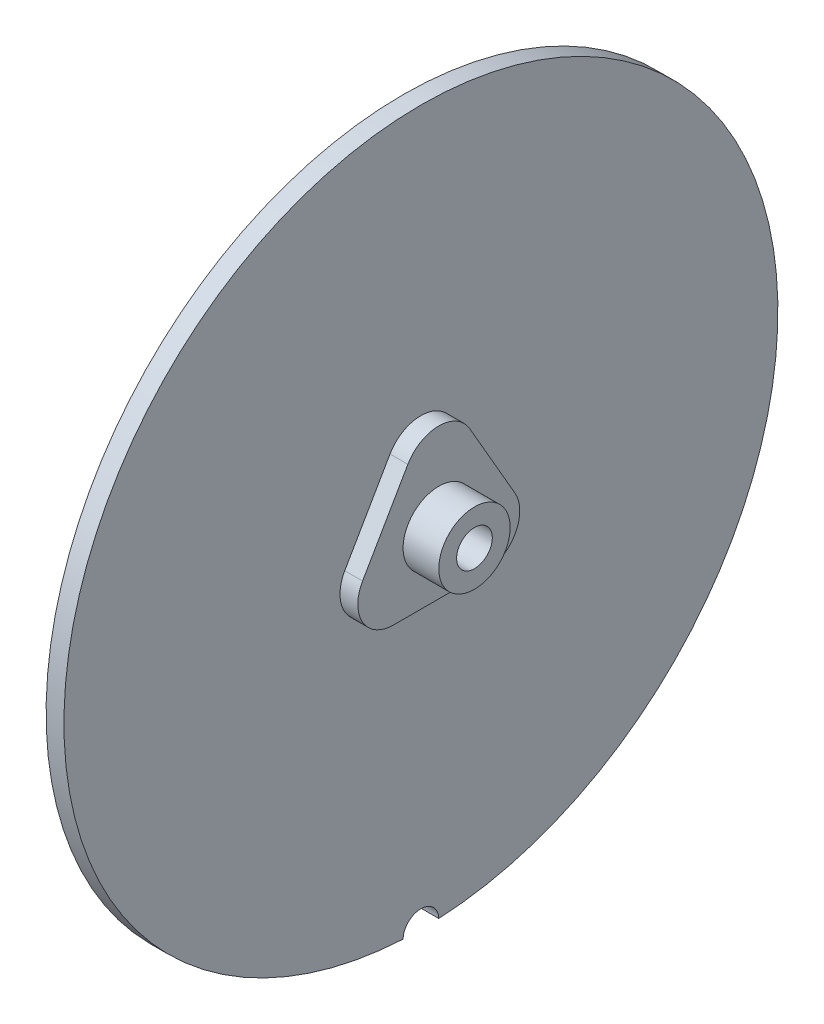
ISO-10303-21;
HEADER;
FILE_DESCRIPTION(('STEP AP214'),'2;1');
FILE_NAME('part.step','',(''),(''),'','','');
FILE_SCHEMA(('AUTOMOTIVE_DESIGN { 1 0 10303 214 1 1 1 1 }'));
ENDSEC;
DATA;
#1=APPLICATION_CONTEXT('core data for automotive mechanical design processes');
#2=APPLICATION_PROTOCOL_DEFINITION('international standard','automotive_design',2000,#1);
#3=PRODUCT_CONTEXT('',#1,'mechanical');
#4=PRODUCT('Part','Part','',(#3));
#5=PRODUCT_RELATED_PRODUCT_CATEGORY('part','',(#4));
#6=PRODUCT_DEFINITION_FORMATION('','',#4);
#7=PRODUCT_DEFINITION_CONTEXT('part definition',#1,'design');
#8=PRODUCT_DEFINITION('design','',#6,#7);
#9=PRODUCT_DEFINITION_SHAPE('','',#8);
#10=(LENGTH_UNIT() NAMED_UNIT(*) SI_UNIT(.MILLI.,.METRE.));
#11=(NAMED_UNIT(*) PLANE_ANGLE_UNIT() SI_UNIT($,.RADIAN.));
#12=(NAMED_UNIT(*) SI_UNIT($,.STERADIAN.) SOLID_ANGLE_UNIT());
#13=UNCERTAINTY_MEASURE_WITH_UNIT(LENGTH_MEASURE(1.E-05),#10,'distance_accuracy_value','');
#14=(GEOMETRIC_REPRESENTATION_CONTEXT(3) GLOBAL_UNCERTAINTY_ASSIGNED_CONTEXT((#13)) GLOBAL_UNIT_ASSIGNED_CONTEXT((#10,
#11,#12)) REPRESENTATION_CONTEXT('',''));
#15=CARTESIAN_POINT('',(0.,0.,0.));
#16=DIRECTION('',(0.,0.,1.));
#17=DIRECTION('',(1.,0.,0.));
#18=AXIS2_PLACEMENT_3D('',#15,#16,#17);
#19=CARTESIAN_POINT('',(3.175,-63.5,0.));
#20=DIRECTION('',(-1.,0.,0.));
#21=DIRECTION('',(0.,0.,1.));
#22=AXIS2_PLACEMENT_3D('',#19,#20,#21);
#23=CYLINDRICAL_SURFACE('',#22,3.17500000000022);
#24=CARTESIAN_POINT('',(0.,-63.5,0.));
#25=DIRECTION('',(1.,0.,0.));
#26=DIRECTION('',(0.,0.,-1.));
#27=AXIS2_PLACEMENT_3D('',#24,#25,#26);
#28=CIRCLE('',#27,3.17500000000022);
#29=CARTESIAN_POINT('',(0.,-63.420625,-3.17400765742244));
#30=VERTEX_POINT('',#29);
#31=CARTESIAN_POINT('',(0.,-63.420625,3.1740076574224));
#32=VERTEX_POINT('',#31);
#33=EDGE_CURVE('E113',#30,#32,#28,.T.);
#34=ORIENTED_EDGE('',*,*,#33,.F.);
#35=DIRECTION('',(-1.,0.,0.));
#36=VECTOR('',#35,1.);
#37=CARTESIAN_POINT('',(3.175,-63.420625,-3.17400765742244));
#38=LINE('',#37,#36);
#39=CARTESIAN_POINT('',(3.175,-63.420625,-3.17400765742244));
#40=VERTEX_POINT('',#39);
#41=EDGE_CURVE('E109',#40,#30,#38,.T.);
#42=ORIENTED_EDGE('',*,*,#41,.F.);
#43=CARTESIAN_POINT('',(3.175,-63.5,0.));
#44=DIRECTION('',(1.,0.,0.));
#45=DIRECTION('',(0.,0.,-1.));
#46=AXIS2_PLACEMENT_3D('',#43,#44,#45);
#47=CIRCLE('',#46,3.17500000000022);
#48=CARTESIAN_POINT('',(3.175,-63.420625,3.1740076574224));
#49=VERTEX_POINT('',#48);
#50=EDGE_CURVE('E114',#40,#49,#47,.T.);
#51=ORIENTED_EDGE('',*,*,#50,.T.);
#52=DIRECTION('',(-1.,0.,0.));
#53=VECTOR('',#52,1.);
#54=CARTESIAN_POINT('',(3.175,-63.420625,3.1740076574224));
#55=LINE('',#54,#53);
#56=EDGE_CURVE('E121',#49,#32,#55,.T.);
#57=ORIENTED_EDGE('',*,*,#56,.T.);
#58=EDGE_LOOP('',(#34,#42,#51,#57));
#59=FACE_BOUND('',#58,.T.);
#60=ADVANCED_FACE('F44',(#59),#23,.F.);
#61=CARTESIAN_POINT('',(3.175,0.,0.));
#62=DIRECTION('',(-1.,0.,0.));
#63=DIRECTION('',(0.,0.,1.));
#64=AXIS2_PLACEMENT_3D('',#61,#62,#63);
#65=CYLINDRICAL_SURFACE('',#64,3.175);
#66=CARTESIAN_POINT('',(0.,0.,0.));
#67=DIRECTION('',(1.,0.,0.));
#68=DIRECTION('',(0.,0.,-1.));
#69=AXIS2_PLACEMENT_3D('',#66,#67,#68);
#70=CIRCLE('',#69,3.175);
#71=CARTESIAN_POINT('',(0.,0.,-3.175));
#72=VERTEX_POINT('',#71);
#73=EDGE_CURVE('E138',#72,#72,#70,.T.);
#74=ORIENTED_EDGE('',*,*,#73,.F.);
#75=EDGE_LOOP('',(#74));
#76=FACE_BOUND('',#75,.T.);
#77=CARTESIAN_POINT('',(12.7,0.,0.));
#78=DIRECTION('',(1.,0.,0.));
#79=DIRECTION('',(0.,0.,-1.));
#80=AXIS2_PLACEMENT_3D('',#77,#78,#79);
#81=CIRCLE('',#80,3.175);
#82=CARTESIAN_POINT('',(12.7,0.,-3.175));
#83=VERTEX_POINT('',#82);
#84=EDGE_CURVE('E216',#83,#83,#81,.T.);
#85=ORIENTED_EDGE('',*,*,#84,.T.);
#86=EDGE_LOOP('',(#85));
#87=FACE_BOUND('',#86,.T.);
#88=ADVANCED_FACE('F249',(#76,#87),#65,.F.);
#89=CARTESIAN_POINT('',(3.175,0.,0.));
#90=DIRECTION('',(-1.,0.,0.));
#91=DIRECTION('',(0.,0.,1.));
#92=AXIS2_PLACEMENT_3D('',#89,#90,#91);
#93=CYLINDRICAL_SURFACE('',#92,63.5);
#94=CARTESIAN_POINT('',(0.,0.,0.));
#95=DIRECTION('',(1.,0.,0.));
#96=DIRECTION('',(0.,0.,-1.));
#97=AXIS2_PLACEMENT_3D('',#94,#95,#96);
#98=CIRCLE('',#97,63.5);
#99=EDGE_CURVE('E133',#30,#32,#98,.T.);
#100=ORIENTED_EDGE('',*,*,#99,.T.);
#101=ORIENTED_EDGE('',*,*,#56,.F.);
#102=CARTESIAN_POINT('',(3.175,0.,0.));
#103=DIRECTION('',(1.,0.,0.));
#104=DIRECTION('',(0.,0.,-1.));
#105=AXIS2_PLACEMENT_3D('',#102,#103,#104);
#106=CIRCLE('',#105,63.5);
#107=EDGE_CURVE('E123',#40,#49,#106,.T.);
#108=ORIENTED_EDGE('',*,*,#107,.F.);
#109=ORIENTED_EDGE('',*,*,#41,.T.);
#110=EDGE_LOOP('',(#100,#101,#108,#109));
#111=FACE_BOUND('',#110,.T.);
#112=ADVANCED_FACE('F125',(#111),#93,.T.);
#113=CARTESIAN_POINT('',(3.175,0.,0.));
#114=DIRECTION('',(1.,0.,0.));
#115=DIRECTION('',(0.,0.,-1.));
#116=AXIS2_PLACEMENT_3D('',#113,#114,#115);
#117=PLANE('',#116);
#118=DIRECTION('',(0.,0.866025403784439,0.5));
#119=VECTOR('',#118,1.);
#120=CARTESIAN_POINT('',(3.175,-10.9985226280624,-19.05));
#121=LINE('',#120,#119);
#122=CARTESIAN_POINT('',(3.175,-1.47352262806237,-13.5507386859688));
#123=VERTEX_POINT('',#122);
#124=CARTESIAN_POINT('',(3.175,12.4720452561247,-5.49926131403119));
#125=VERTEX_POINT('',#124);
#126=EDGE_CURVE('E187',#123,#125,#121,.T.);
#127=ORIENTED_EDGE('',*,*,#126,.F.);
#128=CARTESIAN_POINT('',(3.175,-4.64852262806237,-8.05147737193763));
#129=DIRECTION('',(1.,0.,0.));
#130=DIRECTION('',(0.,0.,-1.));
#131=AXIS2_PLACEMENT_3D('',#128,#129,#130);
#132=CIRCLE('',#131,6.35);
#133=CARTESIAN_POINT('',(3.175,-10.9985226280624,-8.05147737193762));
#134=VERTEX_POINT('',#133);
#135=EDGE_CURVE('E11',#123,#134,#132,.F.);
#136=ORIENTED_EDGE('',*,*,#135,.T.);
#137=DIRECTION('',(0.,0.,-1.));
#138=VECTOR('',#137,1.);
#139=CARTESIAN_POINT('',(3.175,-10.9985226280624,19.05));
#140=LINE('',#139,#138);
#141=CARTESIAN_POINT('',(3.175,-10.9985226280624,8.05147737193764));
#142=VERTEX_POINT('',#141);
#143=EDGE_CURVE('E136',#142,#134,#140,.T.);
#144=ORIENTED_EDGE('',*,*,#143,.F.);
#145=CARTESIAN_POINT('',(3.175,-4.64852262806237,8.05147737193763));
#146=DIRECTION('',(1.,0.,0.));
#147=DIRECTION('',(0.,0.,-1.));
#148=AXIS2_PLACEMENT_3D('',#145,#146,#147);
#149=CIRCLE('',#148,6.35);
#150=CARTESIAN_POINT('',(3.175,-1.47352262806237,13.5507386859688));
#151=VERTEX_POINT('',#150);
#152=EDGE_CURVE('E53',#142,#151,#149,.F.);
#153=ORIENTED_EDGE('',*,*,#152,.T.);
#154=DIRECTION('',(0.,-0.866025403784439,0.5));
#155=VECTOR('',#154,1.);
#156=CARTESIAN_POINT('',(3.175,21.9970452561247,0.));
#157=LINE('',#156,#155);
#158=CARTESIAN_POINT('',(3.175,12.4720452561247,5.49926131403118));
#159=VERTEX_POINT('',#158);
#160=EDGE_CURVE('E185',#159,#151,#157,.T.);
#161=ORIENTED_EDGE('',*,*,#160,.F.);
#162=CARTESIAN_POINT('',(3.175,9.29704525612475,0.));
#163=DIRECTION('',(1.,0.,0.));
#164=DIRECTION('',(0.,0.,-1.));
#165=AXIS2_PLACEMENT_3D('',#162,#163,#164);
#166=CIRCLE('',#165,6.35);
#167=EDGE_CURVE('E177',#159,#125,#166,.F.);
#168=ORIENTED_EDGE('',*,*,#167,.T.);
#169=EDGE_LOOP('',(#127,#136,#144,#153,#161,#168));
#170=FACE_BOUND('',#169,.T.);
#171=ORIENTED_EDGE('',*,*,#50,.F.);
#172=ORIENTED_EDGE('',*,*,#107,.T.);
#173=EDGE_LOOP('',(#171,#172));
#174=FACE_BOUND('',#173,.T.);
#175=ADVANCED_FACE('F129',(#170,#174),#117,.T.);
#176=CARTESIAN_POINT('',(0.,0.,0.));
#177=DIRECTION('',(1.,0.,0.));
#178=DIRECTION('',(0.,0.,-1.));
#179=AXIS2_PLACEMENT_3D('',#176,#177,#178);
#180=PLANE('',#179);
#181=ORIENTED_EDGE('',*,*,#73,.T.);
#182=EDGE_LOOP('',(#181));
#183=FACE_BOUND('',#182,.T.);
#184=ORIENTED_EDGE('',*,*,#33,.T.);
#185=ORIENTED_EDGE('',*,*,#99,.F.);
#186=EDGE_LOOP('',(#184,#185));
#187=FACE_BOUND('',#186,.T.);
#188=ADVANCED_FACE('F260',(#183,#187),#180,.F.);
#189=CARTESIAN_POINT('',(6.35,0.,0.));
#190=DIRECTION('',(1.,0.,0.));
#191=DIRECTION('',(0.,0.,-1.));
#192=AXIS2_PLACEMENT_3D('',#189,#190,#191);
#193=PLANE('',#192);
#194=CARTESIAN_POINT('',(6.35,0.,0.));
#195=DIRECTION('',(1.,0.,0.));
#196=DIRECTION('',(0.,0.,-1.));
#197=AXIS2_PLACEMENT_3D('',#194,#195,#196);
#198=CIRCLE('',#197,6.35);
#199=CARTESIAN_POINT('',(6.35,0.,-6.35));
#200=VERTEX_POINT('',#199);
#201=EDGE_CURVE('E119',#200,#200,#198,.T.);
#202=ORIENTED_EDGE('',*,*,#201,.F.);
#203=EDGE_LOOP('',(#202));
#204=FACE_BOUND('',#203,.T.);
#205=DIRECTION('',(0.,0.866025403784439,0.5));
#206=VECTOR('',#205,1.);
#207=CARTESIAN_POINT('',(6.35,-10.9985226280624,-19.05));
#208=LINE('',#207,#206);
#209=CARTESIAN_POINT('',(6.35,-1.47352262806237,-13.5507386859688));
#210=VERTEX_POINT('',#209);
#211=CARTESIAN_POINT('',(6.35,12.4720452561247,-5.49926131403119));
#212=VERTEX_POINT('',#211);
#213=EDGE_CURVE('E202',#210,#212,#208,.T.);
#214=ORIENTED_EDGE('',*,*,#213,.T.);
#215=CARTESIAN_POINT('',(6.35,9.29704525612475,0.));
#216=DIRECTION('',(1.,0.,0.));
#217=DIRECTION('',(0.,0.,-1.));
#218=AXIS2_PLACEMENT_3D('',#215,#216,#217);
#219=CIRCLE('',#218,6.35);
#220=CARTESIAN_POINT('',(6.35,12.4720452561247,5.49926131403118));
#221=VERTEX_POINT('',#220);
#222=EDGE_CURVE('E169',#212,#221,#219,.T.);
#223=ORIENTED_EDGE('',*,*,#222,.T.);
#224=DIRECTION('',(0.,-0.866025403784439,0.5));
#225=VECTOR('',#224,1.);
#226=CARTESIAN_POINT('',(6.35,21.9970452561247,0.));
#227=LINE('',#226,#225);
#228=CARTESIAN_POINT('',(6.35,-1.47352262806237,13.5507386859688));
#229=VERTEX_POINT('',#228);
#230=EDGE_CURVE('E196',#221,#229,#227,.T.);
#231=ORIENTED_EDGE('',*,*,#230,.T.);
#232=CARTESIAN_POINT('',(6.35,-4.64852262806237,8.05147737193763));
#233=DIRECTION('',(1.,0.,0.));
#234=DIRECTION('',(0.,0.,-1.));
#235=AXIS2_PLACEMENT_3D('',#232,#233,#234);
#236=CIRCLE('',#235,6.35);
#237=CARTESIAN_POINT('',(6.35,-10.9985226280624,8.05147737193764));
#238=VERTEX_POINT('',#237);
#239=EDGE_CURVE('E164',#229,#238,#236,.T.);
#240=ORIENTED_EDGE('',*,*,#239,.T.);
#241=DIRECTION('',(0.,0.,-1.));
#242=VECTOR('',#241,1.);
#243=CARTESIAN_POINT('',(6.35,-10.9985226280624,19.05));
#244=LINE('',#243,#242);
#245=CARTESIAN_POINT('',(6.35,-10.9985226280624,-8.05147737193762));
#246=VERTEX_POINT('',#245);
#247=EDGE_CURVE('E141',#238,#246,#244,.T.);
#248=ORIENTED_EDGE('',*,*,#247,.T.);
#249=CARTESIAN_POINT('',(6.35,-4.64852262806237,-8.05147737193763));
#250=DIRECTION('',(1.,0.,0.));
#251=DIRECTION('',(0.,0.,-1.));
#252=AXIS2_PLACEMENT_3D('',#249,#250,#251);
#253=CIRCLE('',#252,6.35);
#254=EDGE_CURVE('E165',#246,#210,#253,.T.);
#255=ORIENTED_EDGE('',*,*,#254,.T.);
#256=EDGE_LOOP('',(#214,#223,#231,#240,#248,#255));
#257=FACE_BOUND('',#256,.T.);
#258=ADVANCED_FACE('F198',(#204,#257),#193,.T.);
#259=CARTESIAN_POINT('',(6.35,-10.9985226280624,-19.05));
#260=DIRECTION('',(0.,-0.5,0.866025403784439));
#261=DIRECTION('',(0.,-0.866025403784439,-0.5));
#262=AXIS2_PLACEMENT_3D('',#259,#260,#261);
#263=PLANE('',#262);
#264=ORIENTED_EDGE('',*,*,#126,.T.);
#265=DIRECTION('',(-1.,0.,0.));
#266=VECTOR('',#265,1.);
#267=CARTESIAN_POINT('',(6.35,12.4720452561247,-5.49926131403118));
#268=LINE('',#267,#266);
#269=EDGE_CURVE('E157',#125,#212,#268,.F.);
#270=ORIENTED_EDGE('',*,*,#269,.T.);
#271=ORIENTED_EDGE('',*,*,#213,.F.);
#272=DIRECTION('',(-1.,0.,0.));
#273=VECTOR('',#272,1.);
#274=CARTESIAN_POINT('',(6.35,-1.47352262806237,-13.5507386859688));
#275=LINE('',#274,#273);
#276=EDGE_CURVE('E154',#210,#123,#275,.T.);
#277=ORIENTED_EDGE('',*,*,#276,.T.);
#278=EDGE_LOOP('',(#264,#270,#271,#277));
#279=FACE_BOUND('',#278,.T.);
#280=ADVANCED_FACE('F232',(#279),#263,.F.);
#281=CARTESIAN_POINT('',(6.35,21.9970452561247,0.));
#282=DIRECTION('',(0.,-0.5,-0.866025403784439));
#283=DIRECTION('',(0.,0.866025403784439,-0.5));
#284=AXIS2_PLACEMENT_3D('',#281,#282,#283);
#285=PLANE('',#284);
#286=ORIENTED_EDGE('',*,*,#230,.F.);
#287=DIRECTION('',(-1.,0.,0.));
#288=VECTOR('',#287,1.);
#289=CARTESIAN_POINT('',(6.35,12.4720452561247,5.49926131403119));
#290=LINE('',#289,#288);
#291=EDGE_CURVE('E151',#221,#159,#290,.T.);
#292=ORIENTED_EDGE('',*,*,#291,.T.);
#293=ORIENTED_EDGE('',*,*,#160,.T.);
#294=DIRECTION('',(-1.,0.,0.));
#295=VECTOR('',#294,1.);
#296=CARTESIAN_POINT('',(6.35,-1.47352262806238,13.5507386859688));
#297=LINE('',#296,#295);
#298=EDGE_CURVE('E146',#151,#229,#297,.F.);
#299=ORIENTED_EDGE('',*,*,#298,.T.);
#300=EDGE_LOOP('',(#286,#292,#293,#299));
#301=FACE_BOUND('',#300,.T.);
#302=ADVANCED_FACE('F183',(#301),#285,.F.);
#303=CARTESIAN_POINT('',(6.35,-10.9985226280624,19.05));
#304=DIRECTION('',(0.,1.,0.));
#305=DIRECTION('',(0.,0.,1.));
#306=AXIS2_PLACEMENT_3D('',#303,#304,#305);
#307=PLANE('',#306);
#308=ORIENTED_EDGE('',*,*,#247,.F.);
#309=DIRECTION('',(-1.,0.,0.));
#310=VECTOR('',#309,1.);
#311=CARTESIAN_POINT('',(6.35,-10.9985226280624,8.05147737193763));
#312=LINE('',#311,#310);
#313=EDGE_CURVE('E172',#238,#142,#312,.T.);
#314=ORIENTED_EDGE('',*,*,#313,.T.);
#315=ORIENTED_EDGE('',*,*,#143,.T.);
#316=DIRECTION('',(-1.,0.,0.));
#317=VECTOR('',#316,1.);
#318=CARTESIAN_POINT('',(6.35,-10.9985226280624,-8.05147737193763));
#319=LINE('',#318,#317);
#320=EDGE_CURVE('E173',#134,#246,#319,.F.);
#321=ORIENTED_EDGE('',*,*,#320,.T.);
#322=EDGE_LOOP('',(#308,#314,#315,#321));
#323=FACE_BOUND('',#322,.T.);
#324=ADVANCED_FACE('F199',(#323),#307,.F.);
#325=CARTESIAN_POINT('',(12.7,0.,0.));
#326=DIRECTION('',(1.,0.,0.));
#327=DIRECTION('',(0.,0.,-1.));
#328=AXIS2_PLACEMENT_3D('',#325,#326,#327);
#329=PLANE('',#328);
#330=CARTESIAN_POINT('',(12.7,0.,0.));
#331=DIRECTION('',(1.,0.,0.));
#332=DIRECTION('',(0.,0.,-1.));
#333=AXIS2_PLACEMENT_3D('',#330,#331,#332);
#334=CIRCLE('',#333,6.35);
#335=CARTESIAN_POINT('',(12.7,0.,-6.35));
#336=VERTEX_POINT('',#335);
#337=EDGE_CURVE('E211',#336,#336,#334,.T.);
#338=ORIENTED_EDGE('',*,*,#337,.T.);
#339=EDGE_LOOP('',(#338));
#340=FACE_BOUND('',#339,.T.);
#341=ORIENTED_EDGE('',*,*,#84,.F.);
#342=EDGE_LOOP('',(#341));
#343=FACE_BOUND('',#342,.T.);
#344=ADVANCED_FACE('F241',(#340,#343),#329,.T.);
#345=CARTESIAN_POINT('',(12.7,0.,0.));
#346=DIRECTION('',(-1.,0.,0.));
#347=DIRECTION('',(0.,0.,1.));
#348=AXIS2_PLACEMENT_3D('',#345,#346,#347);
#349=CYLINDRICAL_SURFACE('',#348,6.35);
#350=ORIENTED_EDGE('',*,*,#337,.F.);
#351=EDGE_LOOP('',(#350));
#352=FACE_BOUND('',#351,.T.);
#353=ORIENTED_EDGE('',*,*,#201,.T.);
#354=EDGE_LOOP('',(#353));
#355=FACE_BOUND('',#354,.T.);
#356=ADVANCED_FACE('F237',(#352,#355),#349,.T.);
#357=CARTESIAN_POINT('',(6.35,9.29704525612475,0.));
#358=DIRECTION('',(-1.,0.,0.));
#359=DIRECTION('',(0.,0.,1.));
#360=AXIS2_PLACEMENT_3D('',#357,#358,#359);
#361=CYLINDRICAL_SURFACE('',#360,6.35);
#362=ORIENTED_EDGE('',*,*,#222,.F.);
#363=ORIENTED_EDGE('',*,*,#269,.F.);
#364=ORIENTED_EDGE('',*,*,#167,.F.);
#365=ORIENTED_EDGE('',*,*,#291,.F.);
#366=EDGE_LOOP('',(#362,#363,#364,#365));
#367=FACE_BOUND('',#366,.T.);
#368=ADVANCED_FACE('F233',(#367),#361,.T.);
#369=CARTESIAN_POINT('',(6.35,-4.64852262806237,8.05147737193763));
#370=DIRECTION('',(-1.,0.,0.));
#371=DIRECTION('',(0.,0.,1.));
#372=AXIS2_PLACEMENT_3D('',#369,#370,#371);
#373=CYLINDRICAL_SURFACE('',#372,6.35);
#374=ORIENTED_EDGE('',*,*,#239,.F.);
#375=ORIENTED_EDGE('',*,*,#298,.F.);
#376=ORIENTED_EDGE('',*,*,#152,.F.);
#377=ORIENTED_EDGE('',*,*,#313,.F.);
#378=EDGE_LOOP('',(#374,#375,#376,#377));
#379=FACE_BOUND('',#378,.T.);
#380=ADVANCED_FACE('F191',(#379),#373,.T.);
#381=CARTESIAN_POINT('',(6.35,-4.64852262806237,-8.05147737193763));
#382=DIRECTION('',(-1.,0.,0.));
#383=DIRECTION('',(0.,0.,1.));
#384=AXIS2_PLACEMENT_3D('',#381,#382,#383);
#385=CYLINDRICAL_SURFACE('',#384,6.35);
#386=ORIENTED_EDGE('',*,*,#254,.F.);
#387=ORIENTED_EDGE('',*,*,#320,.F.);
#388=ORIENTED_EDGE('',*,*,#135,.F.);
#389=ORIENTED_EDGE('',*,*,#276,.F.);
#390=EDGE_LOOP('',(#386,#387,#388,#389));
#391=FACE_BOUND('',#390,.T.);
#392=ADVANCED_FACE('F50',(#391),#385,.T.);
#393=CLOSED_SHELL('',(#60,#88,#112,#175,#188,#258,#280,#302,#324,#344,#356,#368,#380,#392));
#394=MANIFOLD_SOLID_BREP('B2',#393);
#395=ADVANCED_BREP_SHAPE_REPRESENTATION('',(#18,#394),#14);
#396=SHAPE_DEFINITION_REPRESENTATION(#9,#395);
ENDSEC;
END-ISO-10303-21;
